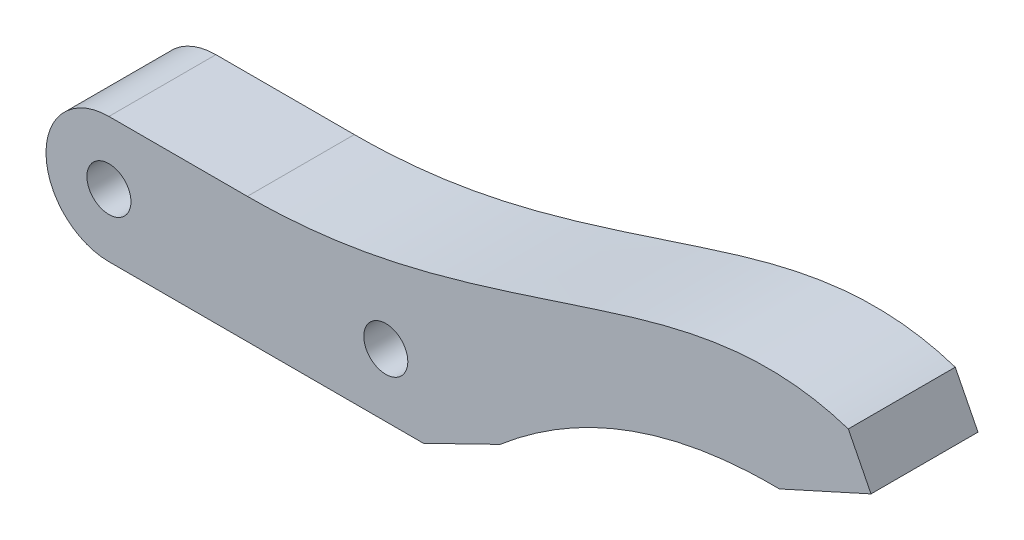
ISO-10303-21;
HEADER;
FILE_DESCRIPTION(('STEP AP214'),'2;1');
FILE_NAME('part.step','',(''),(''),'','','');
FILE_SCHEMA(('AUTOMOTIVE_DESIGN { 1 0 10303 214 1 1 1 1 }'));
ENDSEC;
DATA;
#1=APPLICATION_CONTEXT('core data for automotive mechanical design processes');
#2=APPLICATION_PROTOCOL_DEFINITION('international standard','automotive_design',2000,#1);
#3=PRODUCT_CONTEXT('',#1,'mechanical');
#4=PRODUCT('Part','Part','',(#3));
#5=PRODUCT_RELATED_PRODUCT_CATEGORY('part','',(#4));
#6=PRODUCT_DEFINITION_FORMATION('','',#4);
#7=PRODUCT_DEFINITION_CONTEXT('part definition',#1,'design');
#8=PRODUCT_DEFINITION('design','',#6,#7);
#9=PRODUCT_DEFINITION_SHAPE('','',#8);
#10=(LENGTH_UNIT() NAMED_UNIT(*) SI_UNIT(.MILLI.,.METRE.));
#11=(NAMED_UNIT(*) PLANE_ANGLE_UNIT() SI_UNIT($,.RADIAN.));
#12=(NAMED_UNIT(*) SI_UNIT($,.STERADIAN.) SOLID_ANGLE_UNIT());
#13=UNCERTAINTY_MEASURE_WITH_UNIT(LENGTH_MEASURE(1.E-05),#10,'distance_accuracy_value','');
#14=(GEOMETRIC_REPRESENTATION_CONTEXT(3) GLOBAL_UNCERTAINTY_ASSIGNED_CONTEXT((#13)) GLOBAL_UNIT_ASSIGNED_CONTEXT((#10,
#11,#12)) REPRESENTATION_CONTEXT('',''));
#15=CARTESIAN_POINT('',(0.,0.,0.));
#16=DIRECTION('',(0.,0.,1.));
#17=DIRECTION('',(1.,0.,0.));
#18=AXIS2_PLACEMENT_3D('',#15,#16,#17);
#19=CARTESIAN_POINT('',(-11.,0.,8.5));
#20=DIRECTION('',(0.,0.,-1.));
#21=DIRECTION('',(-1.,0.,0.));
#22=AXIS2_PLACEMENT_3D('',#19,#20,#21);
#23=CYLINDRICAL_SURFACE('',#22,4.99999999999999);
#24=CARTESIAN_POINT('',(-11.,0.,0.));
#25=DIRECTION('',(0.,0.,1.));
#26=DIRECTION('',(1.,0.,0.));
#27=AXIS2_PLACEMENT_3D('',#24,#25,#26);
#28=CIRCLE('',#27,4.99999999999999);
#29=CARTESIAN_POINT('',(-11.,5.,0.));
#30=VERTEX_POINT('',#29);
#31=CARTESIAN_POINT('',(-11.,-5.,0.));
#32=VERTEX_POINT('',#31);
#33=EDGE_CURVE('E217',#30,#32,#28,.T.);
#34=ORIENTED_EDGE('',*,*,#33,.T.);
#35=DIRECTION('',(0.,0.,-1.));
#36=VECTOR('',#35,1.);
#37=CARTESIAN_POINT('',(-11.,-5.,8.5));
#38=LINE('',#37,#36);
#39=CARTESIAN_POINT('',(-11.,-5.,8.5));
#40=VERTEX_POINT('',#39);
#41=EDGE_CURVE('E11',#40,#32,#38,.T.);
#42=ORIENTED_EDGE('',*,*,#41,.F.);
#43=CARTESIAN_POINT('',(-11.,0.,8.5));
#44=DIRECTION('',(0.,0.,1.));
#45=DIRECTION('',(1.,0.,0.));
#46=AXIS2_PLACEMENT_3D('',#43,#44,#45);
#47=CIRCLE('',#46,4.99999999999999);
#48=CARTESIAN_POINT('',(-11.,5.,8.5));
#49=VERTEX_POINT('',#48);
#50=EDGE_CURVE('E204',#49,#40,#47,.T.);
#51=ORIENTED_EDGE('',*,*,#50,.F.);
#52=DIRECTION('',(0.,0.,-1.));
#53=VECTOR('',#52,1.);
#54=CARTESIAN_POINT('',(-11.,5.,8.5));
#55=LINE('',#54,#53);
#56=EDGE_CURVE('E64',#49,#30,#55,.T.);
#57=ORIENTED_EDGE('',*,*,#56,.T.);
#58=EDGE_LOOP('',(#34,#42,#51,#57));
#59=FACE_BOUND('',#58,.T.);
#60=ADVANCED_FACE('F55',(#59),#23,.T.);
#61=CARTESIAN_POINT('',(0.,-5.,8.5));
#62=DIRECTION('',(0.,1.,0.));
#63=DIRECTION('',(0.,0.,1.));
#64=AXIS2_PLACEMENT_3D('',#61,#62,#63);
#65=PLANE('',#64);
#66=DIRECTION('',(1.,0.,0.));
#67=VECTOR('',#66,1.);
#68=CARTESIAN_POINT('',(0.,-5.,0.));
#69=LINE('',#68,#67);
#70=CARTESIAN_POINT('',(13.99,-5.,0.));
#71=VERTEX_POINT('',#70);
#72=EDGE_CURVE('E83',#32,#71,#69,.T.);
#73=ORIENTED_EDGE('',*,*,#72,.T.);
#74=DIRECTION('',(0.,0.,1.));
#75=VECTOR('',#74,1.);
#76=CARTESIAN_POINT('',(13.99,-5.,0.));
#77=LINE('',#76,#75);
#78=CARTESIAN_POINT('',(13.99,-5.,8.5));
#79=VERTEX_POINT('',#78);
#80=EDGE_CURVE('E196',#71,#79,#77,.T.);
#81=ORIENTED_EDGE('',*,*,#80,.T.);
#82=DIRECTION('',(1.,0.,0.));
#83=VECTOR('',#82,1.);
#84=CARTESIAN_POINT('',(0.,-5.,8.5));
#85=LINE('',#84,#83);
#86=EDGE_CURVE('E208',#40,#79,#85,.T.);
#87=ORIENTED_EDGE('',*,*,#86,.F.);
#88=ORIENTED_EDGE('',*,*,#41,.T.);
#89=EDGE_LOOP('',(#73,#81,#87,#88));
#90=FACE_BOUND('',#89,.T.);
#91=ADVANCED_FACE('F248',(#90),#65,.F.);
#92=CARTESIAN_POINT('',(0.,5.,8.5));
#93=DIRECTION('',(0.,1.,0.));
#94=DIRECTION('',(0.,0.,1.));
#95=AXIS2_PLACEMENT_3D('',#92,#93,#94);
#96=PLANE('',#95);
#97=DIRECTION('',(0.,0.,1.));
#98=VECTOR('',#97,1.);
#99=CARTESIAN_POINT('',(0.,5.,0.));
#100=LINE('',#99,#98);
#101=CARTESIAN_POINT('',(0.,5.,0.));
#102=VERTEX_POINT('',#101);
#103=CARTESIAN_POINT('',(0.,5.,8.5));
#104=VERTEX_POINT('',#103);
#105=EDGE_CURVE('E199',#102,#104,#100,.T.);
#106=ORIENTED_EDGE('',*,*,#105,.F.);
#107=DIRECTION('',(1.,0.,0.));
#108=VECTOR('',#107,1.);
#109=CARTESIAN_POINT('',(0.,5.,0.));
#110=LINE('',#109,#108);
#111=EDGE_CURVE('E221',#30,#102,#110,.T.);
#112=ORIENTED_EDGE('',*,*,#111,.F.);
#113=ORIENTED_EDGE('',*,*,#56,.F.);
#114=DIRECTION('',(1.,0.,0.));
#115=VECTOR('',#114,1.);
#116=CARTESIAN_POINT('',(0.,5.,8.5));
#117=LINE('',#116,#115);
#118=EDGE_CURVE('E210',#49,#104,#117,.T.);
#119=ORIENTED_EDGE('',*,*,#118,.T.);
#120=EDGE_LOOP('',(#106,#112,#113,#119));
#121=FACE_BOUND('',#120,.T.);
#122=ADVANCED_FACE('F228',(#121),#96,.T.);
#123=CARTESIAN_POINT('',(-11.,0.,8.5));
#124=DIRECTION('',(0.,0.,-1.));
#125=DIRECTION('',(-1.,0.,0.));
#126=AXIS2_PLACEMENT_3D('',#123,#124,#125);
#127=CYLINDRICAL_SURFACE('',#126,1.75);
#128=CARTESIAN_POINT('',(-11.,0.,8.5));
#129=DIRECTION('',(0.,0.,1.));
#130=DIRECTION('',(1.,0.,0.));
#131=AXIS2_PLACEMENT_3D('',#128,#129,#130);
#132=CIRCLE('',#131,1.75);
#133=CARTESIAN_POINT('',(-9.24999999999999,0.,8.5));
#134=VERTEX_POINT('',#133);
#135=EDGE_CURVE('E201',#134,#134,#132,.T.);
#136=ORIENTED_EDGE('',*,*,#135,.T.);
#137=EDGE_LOOP('',(#136));
#138=FACE_BOUND('',#137,.T.);
#139=CARTESIAN_POINT('',(-11.,0.,0.));
#140=DIRECTION('',(0.,0.,1.));
#141=DIRECTION('',(1.,0.,0.));
#142=AXIS2_PLACEMENT_3D('',#139,#140,#141);
#143=CIRCLE('',#142,1.75);
#144=CARTESIAN_POINT('',(-9.24999999999999,0.,0.));
#145=VERTEX_POINT('',#144);
#146=EDGE_CURVE('E193',#145,#145,#143,.T.);
#147=ORIENTED_EDGE('',*,*,#146,.F.);
#148=EDGE_LOOP('',(#147));
#149=FACE_BOUND('',#148,.T.);
#150=ADVANCED_FACE('F57',(#138,#149),#127,.F.);
#151=CARTESIAN_POINT('',(11.,0.,8.5));
#152=DIRECTION('',(0.,0.,-1.));
#153=DIRECTION('',(-1.,0.,0.));
#154=AXIS2_PLACEMENT_3D('',#151,#152,#153);
#155=CYLINDRICAL_SURFACE('',#154,1.75);
#156=CARTESIAN_POINT('',(11.,0.,8.5));
#157=DIRECTION('',(0.,0.,1.));
#158=DIRECTION('',(1.,0.,0.));
#159=AXIS2_PLACEMENT_3D('',#156,#157,#158);
#160=CIRCLE('',#159,1.75);
#161=CARTESIAN_POINT('',(12.75,0.,8.5));
#162=VERTEX_POINT('',#161);
#163=EDGE_CURVE('E212',#162,#162,#160,.T.);
#164=ORIENTED_EDGE('',*,*,#163,.T.);
#165=EDGE_LOOP('',(#164));
#166=FACE_BOUND('',#165,.T.);
#167=CARTESIAN_POINT('',(11.,0.,0.));
#168=DIRECTION('',(0.,0.,1.));
#169=DIRECTION('',(1.,0.,0.));
#170=AXIS2_PLACEMENT_3D('',#167,#168,#169);
#171=CIRCLE('',#170,1.75);
#172=CARTESIAN_POINT('',(12.75,0.,0.));
#173=VERTEX_POINT('',#172);
#174=EDGE_CURVE('E205',#173,#173,#171,.T.);
#175=ORIENTED_EDGE('',*,*,#174,.F.);
#176=EDGE_LOOP('',(#175));
#177=FACE_BOUND('',#176,.T.);
#178=ADVANCED_FACE('F258',(#166,#177),#155,.F.);
#179=CARTESIAN_POINT('',(0.,0.,8.5));
#180=DIRECTION('',(0.,0.,1.));
#181=DIRECTION('',(1.,0.,0.));
#182=AXIS2_PLACEMENT_3D('',#179,#180,#181);
#183=PLANE('',#182);
#184=ORIENTED_EDGE('',*,*,#135,.F.);
#185=EDGE_LOOP('',(#184));
#186=FACE_BOUND('',#185,.T.);
#187=ORIENTED_EDGE('',*,*,#50,.T.);
#188=ORIENTED_EDGE('',*,*,#86,.T.);
#189=DIRECTION('',(0.898794046299166,0.438371146789079,0.));
#190=VECTOR('',#189,1.);
#191=CARTESIAN_POINT('',(13.99,-5.,8.5));
#192=LINE('',#191,#190);
#193=CARTESIAN_POINT('',(20.08,-2.02970853563389,8.5));
#194=VERTEX_POINT('',#193);
#195=EDGE_CURVE('E231',#79,#194,#192,.T.);
#196=ORIENTED_EDGE('',*,*,#195,.T.);
#197=CARTESIAN_POINT('',(20.08,-2.02970853563389,8.5));
#198=CARTESIAN_POINT('',(29.7387234524963,6.18827081402431,8.5));
#199=CARTESIAN_POINT('',(42.27,6.,8.5));
#200=B_SPLINE_CURVE_WITH_KNOTS('',2,(#197,#198,#199),.UNSPECIFIED.,.F.,.F.,(3,3),(0.,1.),.UNSPECIFIED.);
#201=CARTESIAN_POINT('',(42.27,6.,8.5));
#202=VERTEX_POINT('',#201);
#203=EDGE_CURVE('E188',#194,#202,#200,.T.);
#204=ORIENTED_EDGE('',*,*,#203,.T.);
#205=DIRECTION('',(0.910876713981416,0.41267858186053,0.));
#206=VECTOR('',#205,1.);
#207=CARTESIAN_POINT('',(42.27,6.,8.5));
#208=LINE('',#207,#206);
#209=CARTESIAN_POINT('',(49.5570137118513,9.30142865488424,8.5));
#210=VERTEX_POINT('',#209);
#211=EDGE_CURVE('E135',#202,#210,#208,.T.);
#212=ORIENTED_EDGE('',*,*,#211,.T.);
#213=DIRECTION('',(-0.451753427962831,0.89214283627894,0.));
#214=VECTOR('',#213,1.);
#215=CARTESIAN_POINT('',(49.5570137118513,9.30142865488424,8.5));
#216=LINE('',#215,#214);
#217=CARTESIAN_POINT('',(47.75,12.87,8.5));
#218=VERTEX_POINT('',#217);
#219=EDGE_CURVE('E180',#210,#218,#216,.T.);
#220=ORIENTED_EDGE('',*,*,#219,.T.);
#221=CARTESIAN_POINT('',(47.75,12.87,8.5));
#222=CARTESIAN_POINT('',(40.713583566204,15.2054647324291,8.5));
#223=CARTESIAN_POINT('',(31.8293353258798,12.4366027953315,8.5));
#224=CARTESIAN_POINT('',(16.5451556036514,7.40335958122376,8.5));
#225=CARTESIAN_POINT('',(8.21183603058071,5.00325282658659,8.5));
#226=CARTESIAN_POINT('',(0.,5.,8.5));
#227=B_SPLINE_CURVE_WITH_KNOTS('',3,(#221,#222,#223,#224,#225,#226),.UNSPECIFIED.,.F.,.F.,(4,1,
1,4),(0.,0.433899493723183,0.533899493723183,1.),.UNSPECIFIED.);
#228=EDGE_CURVE('E229',#218,#104,#227,.T.);
#229=ORIENTED_EDGE('',*,*,#228,.T.);
#230=ORIENTED_EDGE('',*,*,#118,.F.);
#231=EDGE_LOOP('',(#187,#188,#196,#204,#212,#220,#229,#230));
#232=FACE_BOUND('',#231,.T.);
#233=ORIENTED_EDGE('',*,*,#163,.F.);
#234=EDGE_LOOP('',(#233));
#235=FACE_BOUND('',#234,.T.);
#236=ADVANCED_FACE('F175',(#186,#232,#235),#183,.T.);
#237=CARTESIAN_POINT('',(0.,0.,0.));
#238=DIRECTION('',(0.,0.,1.));
#239=DIRECTION('',(1.,0.,0.));
#240=AXIS2_PLACEMENT_3D('',#237,#238,#239);
#241=PLANE('',#240);
#242=ORIENTED_EDGE('',*,*,#146,.T.);
#243=EDGE_LOOP('',(#242));
#244=FACE_BOUND('',#243,.T.);
#245=ORIENTED_EDGE('',*,*,#33,.F.);
#246=ORIENTED_EDGE('',*,*,#111,.T.);
#247=CARTESIAN_POINT('',(47.75,12.87,0.));
#248=CARTESIAN_POINT('',(40.713583566204,15.2054647324291,0.));
#249=CARTESIAN_POINT('',(31.8293353258798,12.4366027953315,0.));
#250=CARTESIAN_POINT('',(16.5451556036514,7.40335958122376,0.));
#251=CARTESIAN_POINT('',(8.21183603058071,5.00325282658659,0.));
#252=CARTESIAN_POINT('',(0.,5.,0.));
#253=B_SPLINE_CURVE_WITH_KNOTS('',3,(#247,#248,#249,#250,#251,#252),.UNSPECIFIED.,.F.,.F.,(4,1,
1,4),(0.,0.433899493723183,0.533899493723183,1.),.UNSPECIFIED.);
#254=CARTESIAN_POINT('',(47.75,12.87,0.));
#255=VERTEX_POINT('',#254);
#256=EDGE_CURVE('E119',#255,#102,#253,.T.);
#257=ORIENTED_EDGE('',*,*,#256,.F.);
#258=DIRECTION('',(-0.451753427962831,0.89214283627894,0.));
#259=VECTOR('',#258,1.);
#260=CARTESIAN_POINT('',(49.5570137118513,9.30142865488424,0.));
#261=LINE('',#260,#259);
#262=CARTESIAN_POINT('',(49.5570137118513,9.30142865488424,0.));
#263=VERTEX_POINT('',#262);
#264=EDGE_CURVE('E148',#263,#255,#261,.T.);
#265=ORIENTED_EDGE('',*,*,#264,.F.);
#266=DIRECTION('',(0.910876713981416,0.41267858186053,0.));
#267=VECTOR('',#266,1.);
#268=CARTESIAN_POINT('',(42.27,6.,0.));
#269=LINE('',#268,#267);
#270=CARTESIAN_POINT('',(42.27,6.,0.));
#271=VERTEX_POINT('',#270);
#272=EDGE_CURVE('E132',#271,#263,#269,.T.);
#273=ORIENTED_EDGE('',*,*,#272,.F.);
#274=CARTESIAN_POINT('',(20.08,-2.02970853563389,0.));
#275=CARTESIAN_POINT('',(29.7387234524963,6.18827081402431,0.));
#276=CARTESIAN_POINT('',(42.27,6.,0.));
#277=B_SPLINE_CURVE_WITH_KNOTS('',2,(#274,#275,#276),.UNSPECIFIED.,.F.,.F.,(3,3),(0.,1.),.UNSPECIFIED.);
#278=CARTESIAN_POINT('',(20.08,-2.02970853563389,0.));
#279=VERTEX_POINT('',#278);
#280=EDGE_CURVE('E146',#279,#271,#277,.T.);
#281=ORIENTED_EDGE('',*,*,#280,.F.);
#282=DIRECTION('',(0.898794046299166,0.438371146789079,0.));
#283=VECTOR('',#282,1.);
#284=CARTESIAN_POINT('',(13.99,-5.,0.));
#285=LINE('',#284,#283);
#286=EDGE_CURVE('E151',#71,#279,#285,.T.);
#287=ORIENTED_EDGE('',*,*,#286,.F.);
#288=ORIENTED_EDGE('',*,*,#72,.F.);
#289=EDGE_LOOP('',(#245,#246,#257,#265,#273,#281,#287,#288));
#290=FACE_BOUND('',#289,.T.);
#291=ORIENTED_EDGE('',*,*,#174,.T.);
#292=EDGE_LOOP('',(#291));
#293=FACE_BOUND('',#292,.T.);
#294=ADVANCED_FACE('F144',(#244,#290,#293),#241,.F.);
#295=DIRECTION('',(0.,0.,1.));
#296=VECTOR('',#295,1.);
#297=SURFACE_OF_LINEAR_EXTRUSION('',#253,#296);
#298=ORIENTED_EDGE('',*,*,#228,.F.);
#299=DIRECTION('',(0.,0.,1.));
#300=VECTOR('',#299,1.);
#301=CARTESIAN_POINT('',(47.75,12.87,0.));
#302=LINE('',#301,#300);
#303=EDGE_CURVE('E91',#255,#218,#302,.T.);
#304=ORIENTED_EDGE('',*,*,#303,.F.);
#305=ORIENTED_EDGE('',*,*,#256,.T.);
#306=ORIENTED_EDGE('',*,*,#105,.T.);
#307=EDGE_LOOP('',(#298,#304,#305,#306));
#308=FACE_BOUND('',#307,.T.);
#309=ADVANCED_FACE('F171',(#308),#297,.T.);
#310=CARTESIAN_POINT('',(49.5570137118513,9.30142865488424,0.));
#311=DIRECTION('',(0.89214283627894,0.451753427962831,0.));
#312=DIRECTION('',(-0.451753427962831,0.89214283627894,0.));
#313=AXIS2_PLACEMENT_3D('',#310,#311,#312);
#314=PLANE('',#313);
#315=ORIENTED_EDGE('',*,*,#219,.F.);
#316=DIRECTION('',(0.,0.,1.));
#317=VECTOR('',#316,1.);
#318=CARTESIAN_POINT('',(49.5570137118513,9.30142865488424,0.));
#319=LINE('',#318,#317);
#320=EDGE_CURVE('E140',#263,#210,#319,.T.);
#321=ORIENTED_EDGE('',*,*,#320,.F.);
#322=ORIENTED_EDGE('',*,*,#264,.T.);
#323=ORIENTED_EDGE('',*,*,#303,.T.);
#324=EDGE_LOOP('',(#315,#321,#322,#323));
#325=FACE_BOUND('',#324,.T.);
#326=ADVANCED_FACE('F174',(#325),#314,.T.);
#327=CARTESIAN_POINT('',(42.27,6.,0.));
#328=DIRECTION('',(0.41267858186053,-0.910876713981416,0.));
#329=DIRECTION('',(0.910876713981416,0.41267858186053,0.));
#330=AXIS2_PLACEMENT_3D('',#327,#328,#329);
#331=PLANE('',#330);
#332=ORIENTED_EDGE('',*,*,#211,.F.);
#333=DIRECTION('',(0.,0.,1.));
#334=VECTOR('',#333,1.);
#335=CARTESIAN_POINT('',(42.27,6.,0.));
#336=LINE('',#335,#334);
#337=EDGE_CURVE('E129',#271,#202,#336,.T.);
#338=ORIENTED_EDGE('',*,*,#337,.F.);
#339=ORIENTED_EDGE('',*,*,#272,.T.);
#340=ORIENTED_EDGE('',*,*,#320,.T.);
#341=EDGE_LOOP('',(#332,#338,#339,#340));
#342=FACE_BOUND('',#341,.T.);
#343=ADVANCED_FACE('F131',(#342),#331,.T.);
#344=DIRECTION('',(0.,0.,1.));
#345=VECTOR('',#344,1.);
#346=SURFACE_OF_LINEAR_EXTRUSION('',#277,#345);
#347=ORIENTED_EDGE('',*,*,#203,.F.);
#348=DIRECTION('',(0.,0.,1.));
#349=VECTOR('',#348,1.);
#350=CARTESIAN_POINT('',(20.08,-2.02970853563389,0.));
#351=LINE('',#350,#349);
#352=EDGE_CURVE('E141',#279,#194,#351,.T.);
#353=ORIENTED_EDGE('',*,*,#352,.F.);
#354=ORIENTED_EDGE('',*,*,#280,.T.);
#355=ORIENTED_EDGE('',*,*,#337,.T.);
#356=EDGE_LOOP('',(#347,#353,#354,#355));
#357=FACE_BOUND('',#356,.T.);
#358=ADVANCED_FACE('F150',(#357),#346,.T.);
#359=CARTESIAN_POINT('',(13.99,-5.,0.));
#360=DIRECTION('',(0.438371146789079,-0.898794046299166,0.));
#361=DIRECTION('',(0.898794046299166,0.438371146789079,0.));
#362=AXIS2_PLACEMENT_3D('',#359,#360,#361);
#363=PLANE('',#362);
#364=ORIENTED_EDGE('',*,*,#195,.F.);
#365=ORIENTED_EDGE('',*,*,#80,.F.);
#366=ORIENTED_EDGE('',*,*,#286,.T.);
#367=ORIENTED_EDGE('',*,*,#352,.T.);
#368=EDGE_LOOP('',(#364,#365,#366,#367));
#369=FACE_BOUND('',#368,.T.);
#370=ADVANCED_FACE('F166',(#369),#363,.T.);
#371=CLOSED_SHELL('',(#60,#91,#122,#150,#178,#236,#294,#309,#326,#343,#358,#370));
#372=MANIFOLD_SOLID_BREP('B2',#371);
#373=ADVANCED_BREP_SHAPE_REPRESENTATION('',(#18,#372),#14);
#374=SHAPE_DEFINITION_REPRESENTATION(#9,#373);
ENDSEC;
END-ISO-10303-21;
